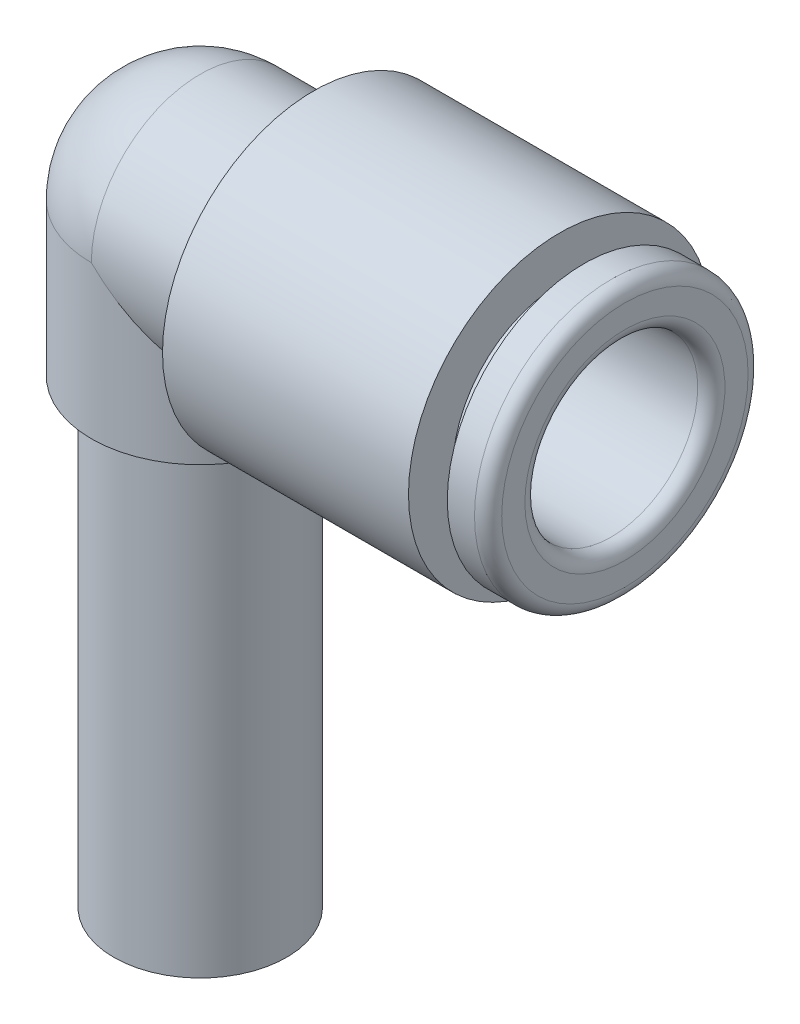
ISO-10303-21;
HEADER;
FILE_DESCRIPTION(('STEP AP214'),'2;1');
FILE_NAME('part.step','',(''),(''),'','','');
FILE_SCHEMA(('AUTOMOTIVE_DESIGN { 1 0 10303 214 1 1 1 1 }'));
ENDSEC;
DATA;
#1=APPLICATION_CONTEXT('core data for automotive mechanical design processes');
#2=APPLICATION_PROTOCOL_DEFINITION('international standard','automotive_design',2000,#1);
#3=PRODUCT_CONTEXT('',#1,'mechanical');
#4=PRODUCT('Part','Part','',(#3));
#5=PRODUCT_RELATED_PRODUCT_CATEGORY('part','',(#4));
#6=PRODUCT_DEFINITION_FORMATION('','',#4);
#7=PRODUCT_DEFINITION_CONTEXT('part definition',#1,'design');
#8=PRODUCT_DEFINITION('design','',#6,#7);
#9=PRODUCT_DEFINITION_SHAPE('','',#8);
#10=(LENGTH_UNIT() NAMED_UNIT(*) SI_UNIT(.MILLI.,.METRE.));
#11=(NAMED_UNIT(*) PLANE_ANGLE_UNIT() SI_UNIT($,.RADIAN.));
#12=(NAMED_UNIT(*) SI_UNIT($,.STERADIAN.) SOLID_ANGLE_UNIT());
#13=UNCERTAINTY_MEASURE_WITH_UNIT(LENGTH_MEASURE(1.E-05),#10,'distance_accuracy_value','');
#14=(GEOMETRIC_REPRESENTATION_CONTEXT(3) GLOBAL_UNCERTAINTY_ASSIGNED_CONTEXT((#13)) GLOBAL_UNIT_ASSIGNED_CONTEXT((#10,
#11,#12)) REPRESENTATION_CONTEXT('',''));
#15=CARTESIAN_POINT('',(0.,0.,0.));
#16=DIRECTION('',(0.,0.,1.));
#17=DIRECTION('',(1.,0.,0.));
#18=AXIS2_PLACEMENT_3D('',#15,#16,#17);
#19=CARTESIAN_POINT('',(14.9137084989848,0.,0.));
#20=DIRECTION('',(-1.,0.,0.));
#21=DIRECTION('',(0.,0.,1.));
#22=AXIS2_PLACEMENT_3D('',#19,#20,#21);
#23=CYLINDRICAL_SURFACE('',#22,4.);
#24=CARTESIAN_POINT('',(0.,0.,0.));
#25=DIRECTION('',(-0.707106781186546,-0.707106781186549,0.));
#26=DIRECTION('',(-0.707106781186549,0.707106781186546,0.));
#27=AXIS2_PLACEMENT_3D('',#24,#25,#26);
#28=ELLIPSE('',#27,5.65685424949239,4.);
#29=CARTESIAN_POINT('',(0.,0.,-4.));
#30=VERTEX_POINT('',#29);
#31=CARTESIAN_POINT('',(3.60000000000001,-3.59999999999994,-1.74355957741639));
#32=VERTEX_POINT('',#31);
#33=EDGE_CURVE('E74',#30,#32,#28,.T.);
#34=ORIENTED_EDGE('',*,*,#33,.F.);
#35=CARTESIAN_POINT('',(0.,0.,0.));
#36=DIRECTION('',(1.,0.,0.));
#37=DIRECTION('',(0.,0.,-1.));
#38=AXIS2_PLACEMENT_3D('',#35,#36,#37);
#39=CIRCLE('',#38,4.);
#40=CARTESIAN_POINT('',(0.,0.,4.));
#41=VERTEX_POINT('',#40);
#42=EDGE_CURVE('E65',#30,#41,#39,.T.);
#43=ORIENTED_EDGE('',*,*,#42,.T.);
#44=CARTESIAN_POINT('',(3.60000000000001,-3.59999999999994,1.74355957741639));
#45=VERTEX_POINT('',#44);
#46=EDGE_CURVE('E58',#45,#41,#28,.T.);
#47=ORIENTED_EDGE('',*,*,#46,.F.);
#48=CARTESIAN_POINT('',(3.6,0.,0.));
#49=DIRECTION('',(1.,0.,0.));
#50=DIRECTION('',(0.,0.,-1.));
#51=AXIS2_PLACEMENT_3D('',#48,#49,#50);
#52=CIRCLE('',#51,4.);
#53=EDGE_CURVE('E70',#32,#45,#52,.T.);
#54=ORIENTED_EDGE('',*,*,#53,.F.);
#55=EDGE_LOOP('',(#34,#43,#47,#54));
#56=FACE_BOUND('',#55,.T.);
#57=ADVANCED_FACE('F37',(#56),#23,.T.);
#58=CARTESIAN_POINT('',(4.16415386311261,0.,0.));
#59=DIRECTION('',(1.,0.,0.));
#60=DIRECTION('',(0.,0.,-1.));
#61=AXIS2_PLACEMENT_3D('',#58,#59,#60);
#62=CONICAL_SURFACE('',#61,5.55,1.22173047639603);
#63=CARTESIAN_POINT('',(4.16415386311261,0.,0.));
#64=DIRECTION('',(1.,0.,0.));
#65=DIRECTION('',(0.,0.,-1.));
#66=AXIS2_PLACEMENT_3D('',#63,#64,#65);
#67=CIRCLE('',#66,5.55);
#68=CARTESIAN_POINT('',(4.16415386311261,0.,-5.55));
#69=VERTEX_POINT('',#68);
#70=EDGE_CURVE('E92',#69,#69,#67,.T.);
#71=ORIENTED_EDGE('',*,*,#70,.F.);
#72=EDGE_LOOP('',(#71));
#73=FACE_BOUND('',#72,.T.);
#74=ORIENTED_EDGE('',*,*,#53,.T.);
#75=CARTESIAN_POINT('',(3.55980000000004,-3.43522724043652,1.8242324303662));
#76=CARTESIAN_POINT('',(3.5822435039696,-3.52829887301869,1.78038006335135));
#77=CARTESIAN_POINT('',(3.60488939553052,-3.62031449496032,1.73424625908981));
#78=CARTESIAN_POINT('',(3.65032446654534,-3.801836290893,1.63649139175729));
#79=CARTESIAN_POINT('',(3.67311385609826,-3.89133089394919,1.58484902183224));
#80=CARTESIAN_POINT('',(3.71872289354011,-4.06794828627225,1.47468524742202));
#81=CARTESIAN_POINT('',(3.74153801167151,-4.15501648055002,1.41607346306425));
#82=CARTESIAN_POINT('',(3.78630769236467,-4.32388603272511,1.2916080231962));
#83=CARTESIAN_POINT('',(3.80826370582502,-4.40569643501347,1.225767361711));
#84=CARTESIAN_POINT('',(3.84729428168507,-4.54977003790955,1.09642247815859));
#85=CARTESIAN_POINT('',(3.86459423312162,-4.61308619940799,1.03417256374623));
#86=CARTESIAN_POINT('',(3.89742006262216,-4.73245406305669,0.902611904896571));
#87=CARTESIAN_POINT('',(3.91294748162366,-4.78851208079805,0.833307394028642));
#88=CARTESIAN_POINT('',(3.94151735499758,-4.89115308959353,0.685700055096922));
#89=CARTESIAN_POINT('',(3.95451739279274,-4.93757511035839,0.60727401323207));
#90=CARTESIAN_POINT('',(3.97628664093904,-5.0150660498598,0.4426536149611));
#91=CARTESIAN_POINT('',(3.98507219642229,-5.04619429439506,0.356490834375437));
#92=CARTESIAN_POINT('',(3.99511038663942,-5.08171823331797,0.206939996803548));
#93=CARTESIAN_POINT('',(3.99786344453755,-5.0914434854175,0.144916390596085));
#94=CARTESIAN_POINT('',(4.00043573967589,-5.10053070281588,0.0200386582617181));
#95=CARTESIAN_POINT('',(4.00025590236181,-5.09989593711461,-0.0428151996328379));
#96=CARTESIAN_POINT('',(3.99698283482345,-5.08833189747928,-0.167357514911469));
#97=CARTESIAN_POINT('',(3.9938944392083,-5.07741970669177,-0.229047732964668));
#98=CARTESIAN_POINT('',(3.98513223756269,-5.04640028395163,-0.349859263037546));
#99=CARTESIAN_POINT('',(3.97945647246894,-5.02628608452715,-0.408978591250064));
#100=CARTESIAN_POINT('',(3.96297529933371,-4.96771880231065,-0.549376448151681));
#101=CARTESIAN_POINT('',(3.95101103665019,-4.92508740555547,-0.628761708844332));
#102=CARTESIAN_POINT('',(3.92403095076682,-4.82840743477338,-0.779682087444569));
#103=CARTESIAN_POINT('',(3.90900666966721,-4.7743271994258,-0.8511945821993));
#104=CARTESIAN_POINT('',(3.87902746379145,-4.66566536516807,-0.978178493942577));
#105=CARTESIAN_POINT('',(3.86430864321613,-4.61202952415543,-1.0345322077051));
#106=CARTESIAN_POINT('',(3.83384004936119,-4.50022260806796,-1.14227892416323));
#107=CARTESIAN_POINT('',(3.81808942052231,-4.44204776148673,-1.19366772037672));
#108=CARTESIAN_POINT('',(3.76976667820315,-4.26211850876804,-1.34152595593869));
#109=CARTESIAN_POINT('',(3.7361949036793,-4.13521535331527,-1.43140766524679));
#110=CARTESIAN_POINT('',(3.6784996686946,-3.91240377876848,-1.57243244830029));
#111=CARTESIAN_POINT('',(3.65455690904918,-3.81859177176744,-1.62711664243125));
#112=CARTESIAN_POINT('',(3.606940029611,-3.62864058588306,-1.73006422997471));
#113=CARTESIAN_POINT('',(3.58326552394823,-3.5325320998817,-1.77838384041));
#114=CARTESIAN_POINT('',(3.55980000000004,-3.43522724043652,-1.8242324303662));
#115=B_SPLINE_CURVE_WITH_KNOTS('',3,(#75,#76,#77,#78,#79,#80,#81,#82,#83,#84,#85,#86,#87,#88,
#89,#90,#91,#92,#93,#94,#95,#96,#97,#98,#99,#100,#101,#102,#103,#104,#105,#106,#107,#108,#109,
#110,#111,#112,#113,#114),.UNSPECIFIED.,.F.,.F.,(4,2,2,2,2,2,2,2,2,2,2,2,2,2,2,2,2,2,2,4),(0.,
0.315973600544878,0.633217020606016,0.955148642595382,1.2765107788866,1.54745022665883,
1.81815231208254,2.09306571283328,2.36690411279439,2.55457922542978,2.74219512020797,
2.92949970900929,3.11694635428386,3.38809519970219,3.66000392784069,3.89719310888608,
4.13458151578385,4.61050369934598,4.94392852367892,5.27417622727573),.UNSPECIFIED.);
#116=EDGE_CURVE('E51',#45,#32,#115,.T.);
#117=ORIENTED_EDGE('',*,*,#116,.T.);
#118=EDGE_LOOP('',(#74,#117));
#119=FACE_BOUND('',#118,.T.);
#120=ADVANCED_FACE('F114',(#73,#119),#62,.T.);
#121=CARTESIAN_POINT('',(28.8977705423414,0.,0.));
#122=DIRECTION('',(-1.,0.,0.));
#123=DIRECTION('',(0.,0.,1.));
#124=AXIS2_PLACEMENT_3D('',#121,#122,#123);
#125=CYLINDRICAL_SURFACE('',#124,5.55);
#126=ORIENTED_EDGE('',*,*,#70,.T.);
#127=EDGE_LOOP('',(#126));
#128=FACE_BOUND('',#127,.T.);
#129=CARTESIAN_POINT('',(13.2,0.,0.));
#130=DIRECTION('',(1.,0.,0.));
#131=DIRECTION('',(0.,0.,-1.));
#132=AXIS2_PLACEMENT_3D('',#129,#130,#131);
#133=CIRCLE('',#132,5.55);
#134=CARTESIAN_POINT('',(13.2,0.,-5.55));
#135=VERTEX_POINT('',#134);
#136=EDGE_CURVE('E71',#135,#135,#133,.T.);
#137=ORIENTED_EDGE('',*,*,#136,.F.);
#138=EDGE_LOOP('',(#137));
#139=FACE_BOUND('',#138,.T.);
#140=ADVANCED_FACE('F119',(#128,#139),#125,.T.);
#141=CARTESIAN_POINT('',(13.2,0.,0.));
#142=DIRECTION('',(1.,0.,0.));
#143=DIRECTION('',(0.,0.,-1.));
#144=AXIS2_PLACEMENT_3D('',#141,#142,#143);
#145=PLANE('',#144);
#146=CARTESIAN_POINT('',(13.2,0.,0.));
#147=DIRECTION('',(-1.,0.,0.));
#148=DIRECTION('',(0.,0.,1.));
#149=AXIS2_PLACEMENT_3D('',#146,#147,#148);
#150=CIRCLE('',#149,3.925);
#151=CARTESIAN_POINT('',(13.2,0.,3.925));
#152=VERTEX_POINT('',#151);
#153=EDGE_CURVE('E78',#152,#152,#150,.T.);
#154=ORIENTED_EDGE('',*,*,#153,.T.);
#155=EDGE_LOOP('',(#154));
#156=FACE_BOUND('',#155,.T.);
#157=ORIENTED_EDGE('',*,*,#136,.T.);
#158=EDGE_LOOP('',(#157));
#159=FACE_BOUND('',#158,.T.);
#160=ADVANCED_FACE('F123',(#156,#159),#145,.T.);
#161=CARTESIAN_POINT('',(15.6,4.525,0.));
#162=DIRECTION('',(-1.,0.,0.));
#163=DIRECTION('',(0.,0.,1.));
#164=AXIS2_PLACEMENT_3D('',#161,#162,#163);
#165=PLANE('',#164);
#166=CARTESIAN_POINT('',(15.6,0.,0.));
#167=DIRECTION('',(-1.,0.,0.));
#168=DIRECTION('',(0.,0.,1.));
#169=AXIS2_PLACEMENT_3D('',#166,#167,#168);
#170=CIRCLE('',#169,3.675);
#171=CARTESIAN_POINT('',(15.6,0.,3.675));
#172=VERTEX_POINT('',#171);
#173=EDGE_CURVE('E91',#172,#172,#170,.T.);
#174=ORIENTED_EDGE('',*,*,#173,.T.);
#175=EDGE_LOOP('',(#174));
#176=FACE_BOUND('',#175,.T.);
#177=CARTESIAN_POINT('',(15.6,0.,0.));
#178=DIRECTION('',(-1.,0.,0.));
#179=DIRECTION('',(0.,0.,1.));
#180=AXIS2_PLACEMENT_3D('',#177,#178,#179);
#181=CIRCLE('',#180,4.525);
#182=CARTESIAN_POINT('',(15.6,0.,4.525));
#183=VERTEX_POINT('',#182);
#184=EDGE_CURVE('E176',#183,#183,#181,.T.);
#185=ORIENTED_EDGE('',*,*,#184,.F.);
#186=EDGE_LOOP('',(#185));
#187=FACE_BOUND('',#186,.T.);
#188=ADVANCED_FACE('F160',(#176,#187),#165,.F.);
#189=CARTESIAN_POINT('',(15.1,0.,0.));
#190=DIRECTION('',(-1.,0.,0.));
#191=DIRECTION('',(0.,0.,1.));
#192=AXIS2_PLACEMENT_3D('',#189,#190,#191);
#193=TOROIDAL_SURFACE('',#192,4.525,0.500000000000001);
#194=CARTESIAN_POINT('',(15.1,0.,0.));
#195=DIRECTION('',(-1.,0.,0.));
#196=DIRECTION('',(0.,0.,1.));
#197=AXIS2_PLACEMENT_3D('',#194,#195,#196);
#198=CIRCLE('',#197,5.025);
#199=CARTESIAN_POINT('',(15.1,0.,5.025));
#200=VERTEX_POINT('',#199);
#201=EDGE_CURVE('E179',#200,#200,#198,.T.);
#202=ORIENTED_EDGE('',*,*,#201,.F.);
#203=EDGE_LOOP('',(#202));
#204=FACE_BOUND('',#203,.T.);
#205=ORIENTED_EDGE('',*,*,#184,.T.);
#206=EDGE_LOOP('',(#205));
#207=FACE_BOUND('',#206,.T.);
#208=ADVANCED_FACE('F156',(#204,#207),#193,.T.);
#209=CARTESIAN_POINT('',(12.5977223806421,0.,0.));
#210=DIRECTION('',(-1.,0.,0.));
#211=DIRECTION('',(0.,0.,1.));
#212=AXIS2_PLACEMENT_3D('',#209,#210,#211);
#213=CYLINDRICAL_SURFACE('',#212,5.025);
#214=CARTESIAN_POINT('',(14.1,0.,0.));
#215=DIRECTION('',(-1.,0.,0.));
#216=DIRECTION('',(0.,0.,1.));
#217=AXIS2_PLACEMENT_3D('',#214,#215,#216);
#218=CIRCLE('',#217,5.025);
#219=CARTESIAN_POINT('',(14.1,0.,5.025));
#220=VERTEX_POINT('',#219);
#221=EDGE_CURVE('E186',#220,#220,#218,.T.);
#222=ORIENTED_EDGE('',*,*,#221,.F.);
#223=EDGE_LOOP('',(#222));
#224=FACE_BOUND('',#223,.T.);
#225=ORIENTED_EDGE('',*,*,#201,.T.);
#226=EDGE_LOOP('',(#225));
#227=FACE_BOUND('',#226,.T.);
#228=ADVANCED_FACE('F152',(#224,#227),#213,.T.);
#229=CARTESIAN_POINT('',(14.1,3.925,0.));
#230=DIRECTION('',(1.,0.,0.));
#231=DIRECTION('',(0.,0.,-1.));
#232=AXIS2_PLACEMENT_3D('',#229,#230,#231);
#233=PLANE('',#232);
#234=CARTESIAN_POINT('',(14.1,0.,0.));
#235=DIRECTION('',(-1.,0.,0.));
#236=DIRECTION('',(0.,0.,1.));
#237=AXIS2_PLACEMENT_3D('',#234,#235,#236);
#238=CIRCLE('',#237,3.925);
#239=CARTESIAN_POINT('',(14.1,0.,3.925));
#240=VERTEX_POINT('',#239);
#241=EDGE_CURVE('E81',#240,#240,#238,.T.);
#242=ORIENTED_EDGE('',*,*,#241,.F.);
#243=EDGE_LOOP('',(#242));
#244=FACE_BOUND('',#243,.T.);
#245=ORIENTED_EDGE('',*,*,#221,.T.);
#246=EDGE_LOOP('',(#245));
#247=FACE_BOUND('',#246,.T.);
#248=ADVANCED_FACE('F148',(#244,#247),#233,.F.);
#249=CARTESIAN_POINT('',(12.5977223806421,0.,0.));
#250=DIRECTION('',(-1.,0.,0.));
#251=DIRECTION('',(0.,0.,1.));
#252=AXIS2_PLACEMENT_3D('',#249,#250,#251);
#253=CYLINDRICAL_SURFACE('',#252,3.925);
#254=ORIENTED_EDGE('',*,*,#153,.F.);
#255=EDGE_LOOP('',(#254));
#256=FACE_BOUND('',#255,.T.);
#257=ORIENTED_EDGE('',*,*,#241,.T.);
#258=EDGE_LOOP('',(#257));
#259=FACE_BOUND('',#258,.T.);
#260=ADVANCED_FACE('F145',(#256,#259),#253,.T.);
#261=CARTESIAN_POINT('',(0.,0.,0.));
#262=DIRECTION('',(0.,0.,-1.));
#263=DIRECTION('',(-1.,0.,0.));
#264=AXIS2_PLACEMENT_3D('',#261,#262,#263);
#265=SPHERICAL_SURFACE('',#264,4.);
#266=ORIENTED_EDGE('',*,*,#42,.F.);
#267=CARTESIAN_POINT('',(0.,0.,0.));
#268=DIRECTION('',(0.,-1.,0.));
#269=DIRECTION('',(0.,0.,1.));
#270=AXIS2_PLACEMENT_3D('',#267,#268,#269);
#271=CIRCLE('',#270,4.);
#272=EDGE_CURVE('E69',#41,#30,#271,.T.);
#273=ORIENTED_EDGE('',*,*,#272,.F.);
#274=EDGE_LOOP('',(#266,#273));
#275=FACE_BOUND('',#274,.T.);
#276=ADVANCED_FACE('F67',(#275),#265,.T.);
#277=CARTESIAN_POINT('',(0.,-16.9137084989848,0.));
#278=DIRECTION('',(0.,1.,0.));
#279=DIRECTION('',(-1.,0.,0.));
#280=AXIS2_PLACEMENT_3D('',#277,#278,#279);
#281=CYLINDRICAL_SURFACE('',#280,4.);
#282=CARTESIAN_POINT('',(0.,-5.6,0.));
#283=DIRECTION('',(0.,1.,0.));
#284=DIRECTION('',(0.,0.,1.));
#285=AXIS2_PLACEMENT_3D('',#282,#283,#284);
#286=CIRCLE('',#285,4.);
#287=CARTESIAN_POINT('',(0.,-5.6,4.));
#288=VERTEX_POINT('',#287);
#289=EDGE_CURVE('E133',#288,#288,#286,.T.);
#290=ORIENTED_EDGE('',*,*,#289,.T.);
#291=EDGE_LOOP('',(#290));
#292=FACE_BOUND('',#291,.T.);
#293=ORIENTED_EDGE('',*,*,#272,.T.);
#294=ORIENTED_EDGE('',*,*,#33,.T.);
#295=ORIENTED_EDGE('',*,*,#116,.F.);
#296=ORIENTED_EDGE('',*,*,#46,.T.);
#297=EDGE_LOOP('',(#293,#294,#295,#296));
#298=FACE_BOUND('',#297,.T.);
#299=ADVANCED_FACE('F77',(#292,#298),#281,.T.);
#300=CARTESIAN_POINT('',(0.,-5.6,0.));
#301=DIRECTION('',(0.,1.,0.));
#302=DIRECTION('',(0.,0.,1.));
#303=AXIS2_PLACEMENT_3D('',#300,#301,#302);
#304=PLANE('',#303);
#305=CARTESIAN_POINT('',(0.,-5.6,0.));
#306=DIRECTION('',(0.,1.,0.));
#307=DIRECTION('',(0.,0.,1.));
#308=AXIS2_PLACEMENT_3D('',#305,#306,#307);
#309=CIRCLE('',#308,3.175);
#310=CARTESIAN_POINT('',(0.,-5.6,3.175));
#311=VERTEX_POINT('',#310);
#312=EDGE_CURVE('E312',#311,#311,#309,.T.);
#313=ORIENTED_EDGE('',*,*,#312,.T.);
#314=EDGE_LOOP('',(#313));
#315=FACE_BOUND('',#314,.T.);
#316=ORIENTED_EDGE('',*,*,#289,.F.);
#317=EDGE_LOOP('',(#316));
#318=FACE_BOUND('',#317,.T.);
#319=ADVANCED_FACE('F140',(#315,#318),#304,.F.);
#320=CARTESIAN_POINT('',(0.,-31.7802561210692,0.));
#321=DIRECTION('',(0.,1.,0.));
#322=DIRECTION('',(0.,0.,1.));
#323=AXIS2_PLACEMENT_3D('',#320,#321,#322);
#324=CYLINDRICAL_SURFACE('',#323,3.175);
#325=CARTESIAN_POINT('',(0.,-22.5113248654052,0.));
#326=DIRECTION('',(0.,1.,0.));
#327=DIRECTION('',(0.,0.,1.));
#328=AXIS2_PLACEMENT_3D('',#325,#326,#327);
#329=CIRCLE('',#328,3.175);
#330=CARTESIAN_POINT('',(0.,-22.5113248654052,3.175));
#331=VERTEX_POINT('',#330);
#332=EDGE_CURVE('E11',#331,#331,#329,.T.);
#333=ORIENTED_EDGE('',*,*,#332,.T.);
#334=EDGE_LOOP('',(#333));
#335=FACE_BOUND('',#334,.T.);
#336=ORIENTED_EDGE('',*,*,#312,.F.);
#337=EDGE_LOOP('',(#336));
#338=FACE_BOUND('',#337,.T.);
#339=ADVANCED_FACE('F240',(#335,#338),#324,.T.);
#340=CARTESIAN_POINT('',(0.,-22.8,0.));
#341=DIRECTION('',(0.,1.,0.));
#342=DIRECTION('',(0.,0.,1.));
#343=AXIS2_PLACEMENT_3D('',#340,#341,#342);
#344=PLANE('',#343);
#345=CARTESIAN_POINT('',(0.,-22.8,0.));
#346=DIRECTION('',(0.,1.,0.));
#347=DIRECTION('',(0.,0.,1.));
#348=AXIS2_PLACEMENT_3D('',#345,#346,#347);
#349=CIRCLE('',#348,1.5875);
#350=CARTESIAN_POINT('',(0.,-22.8,1.5875));
#351=VERTEX_POINT('',#350);
#352=EDGE_CURVE('E303',#351,#351,#349,.T.);
#353=ORIENTED_EDGE('',*,*,#352,.T.);
#354=EDGE_LOOP('',(#353));
#355=FACE_BOUND('',#354,.T.);
#356=CARTESIAN_POINT('',(0.,-22.8,0.));
#357=DIRECTION('',(0.,1.,0.));
#358=DIRECTION('',(0.,0.,1.));
#359=AXIS2_PLACEMENT_3D('',#356,#357,#358);
#360=CIRCLE('',#359,2.675);
#361=CARTESIAN_POINT('',(0.,-22.8,2.675));
#362=VERTEX_POINT('',#361);
#363=EDGE_CURVE('E45',#362,#362,#360,.F.);
#364=ORIENTED_EDGE('',*,*,#363,.T.);
#365=EDGE_LOOP('',(#364));
#366=FACE_BOUND('',#365,.T.);
#367=ADVANCED_FACE('F97',(#355,#366),#344,.F.);
#368=CARTESIAN_POINT('',(-6.68025612106916,0.,0.));
#369=DIRECTION('',(1.,0.,0.));
#370=DIRECTION('',(0.,0.,-1.));
#371=AXIS2_PLACEMENT_3D('',#368,#369,#370);
#372=CYLINDRICAL_SURFACE('',#371,3.175);
#373=CARTESIAN_POINT('',(15.1,0.,0.));
#374=DIRECTION('',(-1.,0.,0.));
#375=DIRECTION('',(0.,0.,1.));
#376=AXIS2_PLACEMENT_3D('',#373,#374,#375);
#377=CIRCLE('',#376,3.175);
#378=CARTESIAN_POINT('',(15.1,0.,-3.175));
#379=VERTEX_POINT('',#378);
#380=EDGE_CURVE('E88',#379,#379,#377,.F.);
#381=CARTESIAN_POINT('',(2.3,0.,0.));
#382=DIRECTION('',(1.,0.,0.));
#383=DIRECTION('',(0.,0.,-1.));
#384=AXIS2_PLACEMENT_3D('',#381,#382,#383);
#385=CIRCLE('',#384,3.175);
#386=CARTESIAN_POINT('',(2.3,0.,-3.175));
#387=VERTEX_POINT('',#386);
#388=EDGE_CURVE('E310',#387,#387,#385,.F.);
#389=CARTESIAN_POINT('',(15.1,0.,-3.175));
#390=CARTESIAN_POINT('',(14.9666666666667,0.,-3.175));
#391=CARTESIAN_POINT('',(14.8333333333333,0.,-3.175));
#392=CARTESIAN_POINT('',(14.5666666666667,0.,-3.175));
#393=CARTESIAN_POINT('',(14.4333333333333,0.,-3.175));
#394=CARTESIAN_POINT('',(14.1666666666667,0.,-3.175));
#395=CARTESIAN_POINT('',(14.0333333333333,0.,-3.175));
#396=CARTESIAN_POINT('',(13.7666666666667,0.,-3.175));
#397=CARTESIAN_POINT('',(13.6333333333333,0.,-3.175));
#398=CARTESIAN_POINT('',(13.3666666666667,0.,-3.175));
#399=CARTESIAN_POINT('',(13.2333333333333,0.,-3.175));
#400=CARTESIAN_POINT('',(12.9666666666667,0.,-3.175));
#401=CARTESIAN_POINT('',(12.8333333333333,0.,-3.175));
#402=CARTESIAN_POINT('',(12.5666666666667,0.,-3.175));
#403=CARTESIAN_POINT('',(12.4333333333333,0.,-3.175));
#404=CARTESIAN_POINT('',(12.1666666666667,0.,-3.175));
#405=CARTESIAN_POINT('',(12.0333333333333,0.,-3.175));
#406=CARTESIAN_POINT('',(11.7666666666667,0.,-3.175));
#407=CARTESIAN_POINT('',(11.6333333333333,0.,-3.175));
#408=CARTESIAN_POINT('',(11.3666666666667,0.,-3.175));
#409=CARTESIAN_POINT('',(11.2333333333333,0.,-3.175));
#410=CARTESIAN_POINT('',(10.9666666666667,0.,-3.175));
#411=CARTESIAN_POINT('',(10.8333333333333,0.,-3.175));
#412=CARTESIAN_POINT('',(10.5666666666667,0.,-3.175));
#413=CARTESIAN_POINT('',(10.4333333333333,0.,-3.175));
#414=CARTESIAN_POINT('',(10.1666666666667,0.,-3.175));
#415=CARTESIAN_POINT('',(10.0333333333333,0.,-3.175));
#416=CARTESIAN_POINT('',(9.76666666666666,0.,-3.175));
#417=CARTESIAN_POINT('',(9.63333333333333,0.,-3.175));
#418=CARTESIAN_POINT('',(9.36666666666666,0.,-3.175));
#419=CARTESIAN_POINT('',(9.23333333333333,0.,-3.175));
#420=CARTESIAN_POINT('',(8.96666666666667,0.,-3.175));
#421=CARTESIAN_POINT('',(8.83333333333333,0.,-3.175));
#422=CARTESIAN_POINT('',(8.56666666666667,0.,-3.175));
#423=CARTESIAN_POINT('',(8.43333333333333,0.,-3.175));
#424=CARTESIAN_POINT('',(8.16666666666667,0.,-3.175));
#425=CARTESIAN_POINT('',(8.03333333333333,0.,-3.175));
#426=CARTESIAN_POINT('',(7.76666666666667,0.,-3.175));
#427=CARTESIAN_POINT('',(7.63333333333333,0.,-3.175));
#428=CARTESIAN_POINT('',(7.36666666666666,0.,-3.175));
#429=CARTESIAN_POINT('',(7.23333333333333,0.,-3.175));
#430=CARTESIAN_POINT('',(6.96666666666667,0.,-3.175));
#431=CARTESIAN_POINT('',(6.83333333333333,0.,-3.175));
#432=CARTESIAN_POINT('',(6.56666666666667,0.,-3.175));
#433=CARTESIAN_POINT('',(6.43333333333333,0.,-3.175));
#434=CARTESIAN_POINT('',(6.16666666666667,0.,-3.175));
#435=CARTESIAN_POINT('',(6.03333333333333,0.,-3.175));
#436=CARTESIAN_POINT('',(5.76666666666667,0.,-3.175));
#437=CARTESIAN_POINT('',(5.63333333333333,0.,-3.175));
#438=CARTESIAN_POINT('',(5.36666666666667,0.,-3.175));
#439=CARTESIAN_POINT('',(5.23333333333333,0.,-3.175));
#440=CARTESIAN_POINT('',(4.96666666666667,0.,-3.175));
#441=CARTESIAN_POINT('',(4.83333333333333,0.,-3.175));
#442=CARTESIAN_POINT('',(4.56666666666667,0.,-3.175));
#443=CARTESIAN_POINT('',(4.43333333333333,0.,-3.175));
#444=CARTESIAN_POINT('',(4.16666666666667,0.,-3.175));
#445=CARTESIAN_POINT('',(4.03333333333333,0.,-3.175));
#446=CARTESIAN_POINT('',(3.76666666666667,0.,-3.175));
#447=CARTESIAN_POINT('',(3.63333333333333,0.,-3.175));
#448=CARTESIAN_POINT('',(3.36666666666666,0.,-3.175));
#449=CARTESIAN_POINT('',(3.23333333333333,0.,-3.175));
#450=CARTESIAN_POINT('',(2.96666666666666,0.,-3.175));
#451=CARTESIAN_POINT('',(2.83333333333333,0.,-3.175));
#452=CARTESIAN_POINT('',(2.56666666666666,0.,-3.175));
#453=CARTESIAN_POINT('',(2.43333333333333,0.,-3.175));
#454=CARTESIAN_POINT('',(2.3,0.,-3.175));
#455=B_SPLINE_CURVE_WITH_KNOTS('',3,(#389,#390,#391,#392,#393,#394,#395,#396,#397,#398,#399,
#400,#401,#402,#403,#404,#405,#406,#407,#408,#409,#410,#411,#412,#413,#414,#415,#416,#417,#418,
#419,#420,#421,#422,#423,#424,#425,#426,#427,#428,#429,#430,#431,#432,#433,#434,#435,#436,#437,
#438,#439,#440,#441,#442,#443,#444,#445,#446,#447,#448,#449,#450,#451,#452,#453,#454),
.UNSPECIFIED.,.F.,.F.,(4,2,2,2,2,2,2,2,2,2,2,2,2,2,2,2,2,2,2,2,2,2,2,2,2,2,2,2,2,2,2,2,4),(0.,
0.400000000000001,0.799999999999999,1.2,1.6,2.,2.4,2.8,3.2,3.6,4.,4.4,4.8,5.2,5.6,6.,6.4,6.8,
7.2,7.6,8.,8.4,8.8,9.2,9.6,10.,10.4,10.8,11.2,11.6,12.,12.4,12.8),.UNSPECIFIED.);
#456=EDGE_CURVE('BSEAM254',#379,#387,#455,.T.);
#457=ORIENTED_EDGE('',*,*,#380,.T.);
#458=ORIENTED_EDGE('',*,*,#388,.T.);
#459=ORIENTED_EDGE('',*,*,#456,.T.);
#460=ORIENTED_EDGE('',*,*,#456,.F.);
#461=EDGE_LOOP('',(#457,#459,#458,#460));
#462=FACE_BOUND('',#461,.T.);
#463=ADVANCED_FACE('F254',(#462),#372,.F.);
#464=CARTESIAN_POINT('',(2.3,0.,0.));
#465=DIRECTION('',(1.,0.,0.));
#466=DIRECTION('',(0.,0.,-1.));
#467=AXIS2_PLACEMENT_3D('',#464,#465,#466);
#468=PLANE('',#467);
#469=CARTESIAN_POINT('',(2.3,0.,0.));
#470=DIRECTION('',(1.,0.,0.));
#471=DIRECTION('',(0.,0.,-1.));
#472=AXIS2_PLACEMENT_3D('',#469,#470,#471);
#473=CIRCLE('',#472,1.5875);
#474=CARTESIAN_POINT('',(2.3,1.5875,0.));
#475=VERTEX_POINT('',#474);
#476=EDGE_CURVE('E304',#475,#475,#473,.T.);
#477=ORIENTED_EDGE('',*,*,#476,.F.);
#478=EDGE_LOOP('',(#477));
#479=FACE_BOUND('',#478,.T.);
#480=ORIENTED_EDGE('',*,*,#388,.F.);
#481=EDGE_LOOP('',(#480));
#482=FACE_BOUND('',#481,.T.);
#483=ADVANCED_FACE('F110',(#479,#482),#468,.T.);
#484=CARTESIAN_POINT('',(15.1,0.,0.));
#485=DIRECTION('',(-1.,0.,0.));
#486=DIRECTION('',(0.,0.,1.));
#487=AXIS2_PLACEMENT_3D('',#484,#485,#486);
#488=TOROIDAL_SURFACE('',#487,3.675,0.5);
#489=ORIENTED_EDGE('',*,*,#173,.F.);
#490=EDGE_LOOP('',(#489));
#491=FACE_BOUND('',#490,.T.);
#492=ORIENTED_EDGE('',*,*,#380,.F.);
#493=EDGE_LOOP('',(#492));
#494=FACE_BOUND('',#493,.T.);
#495=ADVANCED_FACE('F101',(#491,#494),#488,.T.);
#496=CARTESIAN_POINT('',(0.,-22.8,0.));
#497=DIRECTION('',(0.,1.,0.));
#498=DIRECTION('',(0.,0.,1.));
#499=AXIS2_PLACEMENT_3D('',#496,#497,#498);
#500=CONICAL_SURFACE('',#499,2.675,1.04719755119659);
#501=ORIENTED_EDGE('',*,*,#332,.F.);
#502=EDGE_LOOP('',(#501));
#503=FACE_BOUND('',#502,.T.);
#504=ORIENTED_EDGE('',*,*,#363,.F.);
#505=EDGE_LOOP('',(#504));
#506=FACE_BOUND('',#505,.T.);
#507=ADVANCED_FACE('F39',(#503,#506),#500,.T.);
#508=CARTESIAN_POINT('',(2.3,-2.29999999999993,0.));
#509=DIRECTION('',(0.,0.,-1.));
#510=DIRECTION('',(-1.,0.,0.));
#511=AXIS2_PLACEMENT_3D('',#508,#509,#510);
#512=TOROIDAL_SURFACE('',#511,2.29999999999993,1.5875);
#513=CARTESIAN_POINT('',(0.,-2.29999999999993,0.));
#514=DIRECTION('',(0.,1.,0.));
#515=DIRECTION('',(0.,0.,-1.));
#516=AXIS2_PLACEMENT_3D('',#513,#514,#515);
#517=CIRCLE('',#516,1.5875);
#518=CARTESIAN_POINT('',(-1.58749999999993,-2.29999999999992,0.));
#519=VERTEX_POINT('',#518);
#520=EDGE_CURVE('E300',#519,#519,#517,.T.);
#521=CARTESIAN_POINT('',(2.3,-2.29999999999993,0.));
#522=DIRECTION('',(0.,0.,-1.));
#523=DIRECTION('',(-1.,0.,0.));
#524=AXIS2_PLACEMENT_3D('',#521,#522,#523);
#525=CIRCLE('',#524,3.88749999999993);
#526=EDGE_CURVE('',#519,#475,#525,.T.);
#527=ORIENTED_EDGE('',*,*,#520,.F.);
#528=ORIENTED_EDGE('',*,*,#476,.T.);
#529=ORIENTED_EDGE('',*,*,#526,.T.);
#530=ORIENTED_EDGE('',*,*,#526,.F.);
#531=EDGE_LOOP('',(#527,#529,#528,#530));
#532=FACE_BOUND('',#531,.T.);
#533=ADVANCED_FACE('F100',(#532),#512,.F.);
#534=CARTESIAN_POINT('',(0.,5.551,0.));
#535=DIRECTION('',(0.,-1.,0.));
#536=DIRECTION('',(0.,0.,-1.));
#537=AXIS2_PLACEMENT_3D('',#534,#535,#536);
#538=CYLINDRICAL_SURFACE('',#537,1.5875);
#539=ORIENTED_EDGE('',*,*,#520,.T.);
#540=EDGE_LOOP('',(#539));
#541=FACE_BOUND('',#540,.T.);
#542=ORIENTED_EDGE('',*,*,#352,.F.);
#543=EDGE_LOOP('',(#542));
#544=FACE_BOUND('',#543,.T.);
#545=ADVANCED_FACE('F107',(#541,#544),#538,.F.);
#546=CLOSED_SHELL('',(#57,#120,#140,#160,#188,#208,#228,#248,#260,#276,#299,#319,#339,#367,#463,
#483,#495,#507,#533,#545));
#547=MANIFOLD_SOLID_BREP('B2',#546);
#548=ADVANCED_BREP_SHAPE_REPRESENTATION('',(#18,#547),#14);
#549=SHAPE_DEFINITION_REPRESENTATION(#9,#548);
ENDSEC;
END-ISO-10303-21;
